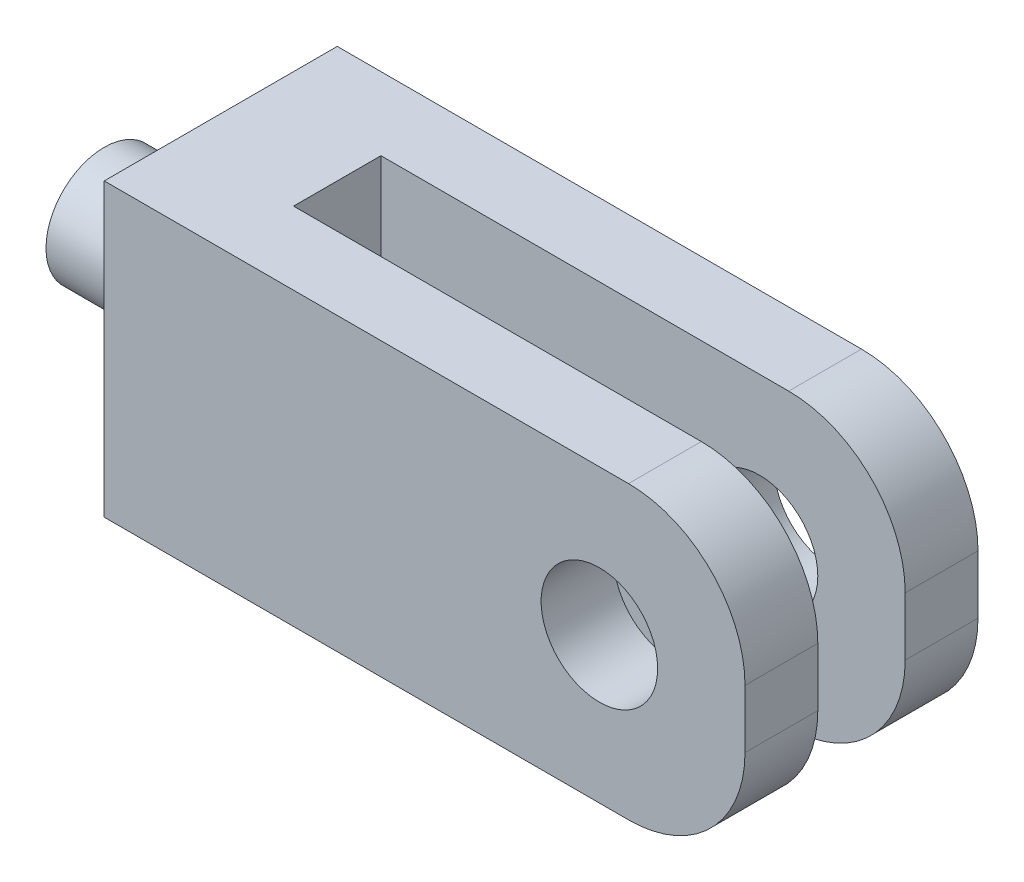
ISO-10303-21;
HEADER;
FILE_DESCRIPTION(('STEP AP214'),'2;1');
FILE_NAME('part.step','',(''),(''),'','','');
FILE_SCHEMA(('AUTOMOTIVE_DESIGN { 1 0 10303 214 1 1 1 1 }'));
ENDSEC;
DATA;
#1=APPLICATION_CONTEXT('core data for automotive mechanical design processes');
#2=APPLICATION_PROTOCOL_DEFINITION('international standard','automotive_design',2000,#1);
#3=PRODUCT_CONTEXT('',#1,'mechanical');
#4=PRODUCT('Part','Part','',(#3));
#5=PRODUCT_RELATED_PRODUCT_CATEGORY('part','',(#4));
#6=PRODUCT_DEFINITION_FORMATION('','',#4);
#7=PRODUCT_DEFINITION_CONTEXT('part definition',#1,'design');
#8=PRODUCT_DEFINITION('design','',#6,#7);
#9=PRODUCT_DEFINITION_SHAPE('','',#8);
#10=(LENGTH_UNIT() NAMED_UNIT(*) SI_UNIT(.MILLI.,.METRE.));
#11=(NAMED_UNIT(*) PLANE_ANGLE_UNIT() SI_UNIT($,.RADIAN.));
#12=(NAMED_UNIT(*) SI_UNIT($,.STERADIAN.) SOLID_ANGLE_UNIT());
#13=UNCERTAINTY_MEASURE_WITH_UNIT(LENGTH_MEASURE(1.E-05),#10,'distance_accuracy_value','');
#14=(GEOMETRIC_REPRESENTATION_CONTEXT(3) GLOBAL_UNCERTAINTY_ASSIGNED_CONTEXT((#13)) GLOBAL_UNIT_ASSIGNED_CONTEXT((#10,
#11,#12)) REPRESENTATION_CONTEXT('',''));
#15=CARTESIAN_POINT('',(0.,0.,0.));
#16=DIRECTION('',(0.,0.,1.));
#17=DIRECTION('',(1.,0.,0.));
#18=AXIS2_PLACEMENT_3D('',#15,#16,#17);
#19=CARTESIAN_POINT('',(82.5,37.5,60.));
#20=DIRECTION('',(1.,0.,0.));
#21=DIRECTION('',(0.,1.,0.));
#22=AXIS2_PLACEMENT_3D('',#19,#20,#21);
#23=PLANE('',#22);
#24=DIRECTION('',(0.,-1.,0.));
#25=VECTOR('',#24,1.);
#26=CARTESIAN_POINT('',(82.5,37.5,60.));
#27=LINE('',#26,#25);
#28=CARTESIAN_POINT('',(82.5,7.50000000000001,60.));
#29=VERTEX_POINT('',#28);
#30=CARTESIAN_POINT('',(82.5,-7.49999999999999,60.));
#31=VERTEX_POINT('',#30);
#32=EDGE_CURVE('E155',#29,#31,#27,.T.);
#33=ORIENTED_EDGE('',*,*,#32,.T.);
#34=DIRECTION('',(0.,0.,-1.));
#35=VECTOR('',#34,1.);
#36=CARTESIAN_POINT('',(82.5,-7.49999999999999,60.));
#37=LINE('',#36,#35);
#38=CARTESIAN_POINT('',(82.5,-7.49999999999999,41.25));
#39=VERTEX_POINT('',#38);
#40=EDGE_CURVE('E183',#31,#39,#37,.T.);
#41=ORIENTED_EDGE('',*,*,#40,.T.);
#42=DIRECTION('',(0.,-1.,0.));
#43=VECTOR('',#42,1.);
#44=CARTESIAN_POINT('',(82.5,-37.5,41.25));
#45=LINE('',#44,#43);
#46=CARTESIAN_POINT('',(82.5,7.50000000000001,41.25));
#47=VERTEX_POINT('',#46);
#48=EDGE_CURVE('E218',#47,#39,#45,.T.);
#49=ORIENTED_EDGE('',*,*,#48,.F.);
#50=DIRECTION('',(0.,0.,-1.));
#51=VECTOR('',#50,1.);
#52=CARTESIAN_POINT('',(82.5,7.50000000000001,60.));
#53=LINE('',#52,#51);
#54=EDGE_CURVE('E179',#47,#29,#53,.F.);
#55=ORIENTED_EDGE('',*,*,#54,.T.);
#56=EDGE_LOOP('',(#33,#41,#49,#55));
#57=FACE_BOUND('',#56,.T.);
#58=ADVANCED_FACE('F34',(#57),#23,.T.);
#59=DIRECTION('',(0.,1.,0.));
#60=VECTOR('',#59,1.);
#61=CARTESIAN_POINT('',(82.5,-37.5,18.75));
#62=LINE('',#61,#60);
#63=CARTESIAN_POINT('',(82.5,-7.49999999999999,18.75));
#64=VERTEX_POINT('',#63);
#65=CARTESIAN_POINT('',(82.5,7.50000000000001,18.75));
#66=VERTEX_POINT('',#65);
#67=EDGE_CURVE('E230',#64,#66,#62,.T.);
#68=ORIENTED_EDGE('',*,*,#67,.F.);
#69=DIRECTION('',(0.,0.,-1.));
#70=VECTOR('',#69,1.);
#71=CARTESIAN_POINT('',(82.5,-7.49999999999999,60.));
#72=LINE('',#71,#70);
#73=CARTESIAN_POINT('',(82.5,-7.49999999999999,0.));
#74=VERTEX_POINT('',#73);
#75=EDGE_CURVE('E199',#64,#74,#72,.T.);
#76=ORIENTED_EDGE('',*,*,#75,.T.);
#77=DIRECTION('',(0.,-1.,0.));
#78=VECTOR('',#77,1.);
#79=CARTESIAN_POINT('',(82.5,37.5,0.));
#80=LINE('',#79,#78);
#81=CARTESIAN_POINT('',(82.5,7.50000000000001,0.));
#82=VERTEX_POINT('',#81);
#83=EDGE_CURVE('E167',#82,#74,#80,.T.);
#84=ORIENTED_EDGE('',*,*,#83,.F.);
#85=DIRECTION('',(0.,0.,-1.));
#86=VECTOR('',#85,1.);
#87=CARTESIAN_POINT('',(82.5,7.50000000000001,18.75));
#88=LINE('',#87,#86);
#89=EDGE_CURVE('E197',#82,#66,#88,.F.);
#90=ORIENTED_EDGE('',*,*,#89,.T.);
#91=EDGE_LOOP('',(#68,#76,#84,#90));
#92=FACE_BOUND('',#91,.T.);
#93=ADVANCED_FACE('F271',(#92),#23,.T.);
#94=CARTESIAN_POINT('',(82.5,37.5,60.));
#95=DIRECTION('',(0.,-1.,0.));
#96=DIRECTION('',(1.,0.,0.));
#97=AXIS2_PLACEMENT_3D('',#94,#95,#96);
#98=PLANE('',#97);
#99=DIRECTION('',(1.,0.,0.));
#100=VECTOR('',#99,1.);
#101=CARTESIAN_POINT('',(-52.5,37.5,18.75));
#102=LINE('',#101,#100);
#103=CARTESIAN_POINT('',(-52.5,37.5,18.75));
#104=VERTEX_POINT('',#103);
#105=CARTESIAN_POINT('',(52.5,37.5,18.75));
#106=VERTEX_POINT('',#105);
#107=EDGE_CURVE('E130',#104,#106,#102,.T.);
#108=ORIENTED_EDGE('',*,*,#107,.T.);
#109=DIRECTION('',(0.,0.,-1.));
#110=VECTOR('',#109,1.);
#111=CARTESIAN_POINT('',(52.5,37.5,0.));
#112=LINE('',#111,#110);
#113=CARTESIAN_POINT('',(52.5,37.5,0.));
#114=VERTEX_POINT('',#113);
#115=EDGE_CURVE('E42',#106,#114,#112,.T.);
#116=ORIENTED_EDGE('',*,*,#115,.T.);
#117=DIRECTION('',(-1.,0.,0.));
#118=VECTOR('',#117,1.);
#119=CARTESIAN_POINT('',(82.5,37.5,0.));
#120=LINE('',#119,#118);
#121=CARTESIAN_POINT('',(-82.5,37.5,0.));
#122=VERTEX_POINT('',#121);
#123=EDGE_CURVE('E159',#114,#122,#120,.T.);
#124=ORIENTED_EDGE('',*,*,#123,.T.);
#125=DIRECTION('',(0.,0.,-1.));
#126=VECTOR('',#125,1.);
#127=CARTESIAN_POINT('',(-82.5,37.5,60.));
#128=LINE('',#127,#126);
#129=CARTESIAN_POINT('',(-82.5,37.5,60.));
#130=VERTEX_POINT('',#129);
#131=EDGE_CURVE('E176',#130,#122,#128,.T.);
#132=ORIENTED_EDGE('',*,*,#131,.F.);
#133=DIRECTION('',(-1.,0.,0.));
#134=VECTOR('',#133,1.);
#135=CARTESIAN_POINT('',(82.5,37.5,60.));
#136=LINE('',#135,#134);
#137=CARTESIAN_POINT('',(52.5,37.5,60.));
#138=VERTEX_POINT('',#137);
#139=EDGE_CURVE('E164',#138,#130,#136,.T.);
#140=ORIENTED_EDGE('',*,*,#139,.F.);
#141=DIRECTION('',(0.,0.,-1.));
#142=VECTOR('',#141,1.);
#143=CARTESIAN_POINT('',(52.5,37.5,41.25));
#144=LINE('',#143,#142);
#145=CARTESIAN_POINT('',(52.5,37.5,41.25));
#146=VERTEX_POINT('',#145);
#147=EDGE_CURVE('E208',#138,#146,#144,.T.);
#148=ORIENTED_EDGE('',*,*,#147,.T.);
#149=DIRECTION('',(1.,0.,0.));
#150=VECTOR('',#149,1.);
#151=CARTESIAN_POINT('',(-52.5,37.5,41.25));
#152=LINE('',#151,#150);
#153=CARTESIAN_POINT('',(-52.5,37.5,41.25));
#154=VERTEX_POINT('',#153);
#155=EDGE_CURVE('E150',#154,#146,#152,.T.);
#156=ORIENTED_EDGE('',*,*,#155,.F.);
#157=DIRECTION('',(0.,0.,1.));
#158=VECTOR('',#157,1.);
#159=CARTESIAN_POINT('',(-52.5,37.5,41.25));
#160=LINE('',#159,#158);
#161=EDGE_CURVE('E134',#104,#154,#160,.T.);
#162=ORIENTED_EDGE('',*,*,#161,.F.);
#163=EDGE_LOOP('',(#108,#116,#124,#132,#140,#148,#156,#162));
#164=FACE_BOUND('',#163,.T.);
#165=ADVANCED_FACE('F241',(#164),#98,.F.);
#166=CARTESIAN_POINT('',(-82.5,37.5,60.));
#167=DIRECTION('',(1.,0.,0.));
#168=DIRECTION('',(0.,0.,-1.));
#169=AXIS2_PLACEMENT_3D('',#166,#167,#168);
#170=PLANE('',#169);
#171=CARTESIAN_POINT('',(-82.5,0.,30.));
#172=DIRECTION('',(1.,0.,0.));
#173=DIRECTION('',(0.,0.,-1.));
#174=AXIS2_PLACEMENT_3D('',#171,#172,#173);
#175=CIRCLE('',#174,15.);
#176=CARTESIAN_POINT('',(-82.5,0.,15.));
#177=VERTEX_POINT('',#176);
#178=EDGE_CURVE('E11',#177,#177,#175,.F.);
#179=ORIENTED_EDGE('',*,*,#178,.F.);
#180=EDGE_LOOP('',(#179));
#181=FACE_BOUND('',#180,.T.);
#182=DIRECTION('',(0.,-1.,0.));
#183=VECTOR('',#182,1.);
#184=CARTESIAN_POINT('',(-82.5,37.5,0.));
#185=LINE('',#184,#183);
#186=CARTESIAN_POINT('',(-82.5,-37.5,0.));
#187=VERTEX_POINT('',#186);
#188=EDGE_CURVE('E172',#122,#187,#185,.T.);
#189=ORIENTED_EDGE('',*,*,#188,.T.);
#190=DIRECTION('',(0.,0.,-1.));
#191=VECTOR('',#190,1.);
#192=CARTESIAN_POINT('',(-82.5,-37.5,60.));
#193=LINE('',#192,#191);
#194=CARTESIAN_POINT('',(-82.5,-37.5,60.));
#195=VERTEX_POINT('',#194);
#196=EDGE_CURVE('E166',#195,#187,#193,.T.);
#197=ORIENTED_EDGE('',*,*,#196,.F.);
#198=DIRECTION('',(0.,-1.,0.));
#199=VECTOR('',#198,1.);
#200=CARTESIAN_POINT('',(-82.5,37.5,60.));
#201=LINE('',#200,#199);
#202=EDGE_CURVE('E161',#130,#195,#201,.T.);
#203=ORIENTED_EDGE('',*,*,#202,.F.);
#204=ORIENTED_EDGE('',*,*,#131,.T.);
#205=EDGE_LOOP('',(#189,#197,#203,#204));
#206=FACE_BOUND('',#205,.T.);
#207=ADVANCED_FACE('F261',(#181,#206),#170,.F.);
#208=CARTESIAN_POINT('',(82.5,-37.5,60.));
#209=DIRECTION('',(0.,-1.,0.));
#210=DIRECTION('',(1.,0.,0.));
#211=AXIS2_PLACEMENT_3D('',#208,#209,#210);
#212=PLANE('',#211);
#213=DIRECTION('',(1.,0.,0.));
#214=VECTOR('',#213,1.);
#215=CARTESIAN_POINT('',(-52.5,-37.5,41.25));
#216=LINE('',#215,#214);
#217=CARTESIAN_POINT('',(-52.5,-37.5,41.25));
#218=VERTEX_POINT('',#217);
#219=CARTESIAN_POINT('',(52.5,-37.5,41.25));
#220=VERTEX_POINT('',#219);
#221=EDGE_CURVE('E148',#218,#220,#216,.T.);
#222=ORIENTED_EDGE('',*,*,#221,.T.);
#223=DIRECTION('',(0.,0.,-1.));
#224=VECTOR('',#223,1.);
#225=CARTESIAN_POINT('',(52.5,-37.5,60.));
#226=LINE('',#225,#224);
#227=CARTESIAN_POINT('',(52.5,-37.5,60.));
#228=VERTEX_POINT('',#227);
#229=EDGE_CURVE('E191',#220,#228,#226,.F.);
#230=ORIENTED_EDGE('',*,*,#229,.T.);
#231=DIRECTION('',(-1.,0.,0.));
#232=VECTOR('',#231,1.);
#233=CARTESIAN_POINT('',(82.5,-37.5,60.));
#234=LINE('',#233,#232);
#235=EDGE_CURVE('E158',#228,#195,#234,.T.);
#236=ORIENTED_EDGE('',*,*,#235,.T.);
#237=ORIENTED_EDGE('',*,*,#196,.T.);
#238=DIRECTION('',(-1.,0.,0.));
#239=VECTOR('',#238,1.);
#240=CARTESIAN_POINT('',(82.5,-37.5,0.));
#241=LINE('',#240,#239);
#242=CARTESIAN_POINT('',(52.5,-37.5,0.));
#243=VERTEX_POINT('',#242);
#244=EDGE_CURVE('E170',#243,#187,#241,.T.);
#245=ORIENTED_EDGE('',*,*,#244,.F.);
#246=DIRECTION('',(0.,0.,-1.));
#247=VECTOR('',#246,1.);
#248=CARTESIAN_POINT('',(52.5,-37.5,60.));
#249=LINE('',#248,#247);
#250=CARTESIAN_POINT('',(52.5,-37.5,18.75));
#251=VERTEX_POINT('',#250);
#252=EDGE_CURVE('E147',#243,#251,#249,.F.);
#253=ORIENTED_EDGE('',*,*,#252,.T.);
#254=DIRECTION('',(1.,0.,0.));
#255=VECTOR('',#254,1.);
#256=CARTESIAN_POINT('',(-52.5,-37.5,18.75));
#257=LINE('',#256,#255);
#258=CARTESIAN_POINT('',(-52.5,-37.5,18.75));
#259=VERTEX_POINT('',#258);
#260=EDGE_CURVE('E128',#259,#251,#257,.T.);
#261=ORIENTED_EDGE('',*,*,#260,.F.);
#262=DIRECTION('',(0.,0.,-1.));
#263=VECTOR('',#262,1.);
#264=CARTESIAN_POINT('',(-52.5,-37.5,41.25));
#265=LINE('',#264,#263);
#266=EDGE_CURVE('E135',#218,#259,#265,.T.);
#267=ORIENTED_EDGE('',*,*,#266,.F.);
#268=EDGE_LOOP('',(#222,#230,#236,#237,#245,#253,#261,#267));
#269=FACE_BOUND('',#268,.T.);
#270=ADVANCED_FACE('F144',(#269),#212,.T.);
#271=CARTESIAN_POINT('',(0.,0.,60.));
#272=DIRECTION('',(0.,0.,-1.));
#273=DIRECTION('',(-1.,0.,0.));
#274=AXIS2_PLACEMENT_3D('',#271,#272,#273);
#275=PLANE('',#274);
#276=CARTESIAN_POINT('',(45.,0.,60.));
#277=DIRECTION('',(0.,0.,1.));
#278=DIRECTION('',(1.,0.,0.));
#279=AXIS2_PLACEMENT_3D('',#276,#277,#278);
#280=CIRCLE('',#279,15.);
#281=CARTESIAN_POINT('',(60.,0.,60.));
#282=VERTEX_POINT('',#281);
#283=EDGE_CURVE('E221',#282,#282,#280,.T.);
#284=ORIENTED_EDGE('',*,*,#283,.F.);
#285=EDGE_LOOP('',(#284));
#286=FACE_BOUND('',#285,.T.);
#287=ORIENTED_EDGE('',*,*,#235,.F.);
#288=CARTESIAN_POINT('',(52.5,-7.49999999999999,60.));
#289=DIRECTION('',(0.,0.,-1.));
#290=DIRECTION('',(-1.,0.,0.));
#291=AXIS2_PLACEMENT_3D('',#288,#289,#290);
#292=CIRCLE('',#291,30.);
#293=EDGE_CURVE('E195',#228,#31,#292,.F.);
#294=ORIENTED_EDGE('',*,*,#293,.T.);
#295=ORIENTED_EDGE('',*,*,#32,.F.);
#296=CARTESIAN_POINT('',(52.5,7.5,60.));
#297=DIRECTION('',(0.,0.,-1.));
#298=DIRECTION('',(-1.,0.,0.));
#299=AXIS2_PLACEMENT_3D('',#296,#297,#298);
#300=CIRCLE('',#299,30.);
#301=EDGE_CURVE('E193',#29,#138,#300,.F.);
#302=ORIENTED_EDGE('',*,*,#301,.T.);
#303=ORIENTED_EDGE('',*,*,#139,.T.);
#304=ORIENTED_EDGE('',*,*,#202,.T.);
#305=EDGE_LOOP('',(#287,#294,#295,#302,#303,#304));
#306=FACE_BOUND('',#305,.T.);
#307=ADVANCED_FACE('F253',(#286,#306),#275,.F.);
#308=CARTESIAN_POINT('',(0.,0.,0.));
#309=DIRECTION('',(0.,0.,-1.));
#310=DIRECTION('',(-1.,0.,0.));
#311=AXIS2_PLACEMENT_3D('',#308,#309,#310);
#312=PLANE('',#311);
#313=CARTESIAN_POINT('',(45.,0.,0.));
#314=DIRECTION('',(0.,0.,1.));
#315=DIRECTION('',(1.,0.,0.));
#316=AXIS2_PLACEMENT_3D('',#313,#314,#315);
#317=CIRCLE('',#316,15.);
#318=CARTESIAN_POINT('',(60.,0.,0.));
#319=VERTEX_POINT('',#318);
#320=EDGE_CURVE('E214',#319,#319,#317,.T.);
#321=ORIENTED_EDGE('',*,*,#320,.T.);
#322=EDGE_LOOP('',(#321));
#323=FACE_BOUND('',#322,.T.);
#324=ORIENTED_EDGE('',*,*,#83,.T.);
#325=CARTESIAN_POINT('',(52.5,-7.49999999999999,0.));
#326=DIRECTION('',(0.,0.,-1.));
#327=DIRECTION('',(-1.,0.,0.));
#328=AXIS2_PLACEMENT_3D('',#325,#326,#327);
#329=CIRCLE('',#328,30.);
#330=EDGE_CURVE('E203',#74,#243,#329,.T.);
#331=ORIENTED_EDGE('',*,*,#330,.T.);
#332=ORIENTED_EDGE('',*,*,#244,.T.);
#333=ORIENTED_EDGE('',*,*,#188,.F.);
#334=ORIENTED_EDGE('',*,*,#123,.F.);
#335=CARTESIAN_POINT('',(52.5,7.5,0.));
#336=DIRECTION('',(0.,0.,-1.));
#337=DIRECTION('',(-1.,0.,0.));
#338=AXIS2_PLACEMENT_3D('',#335,#336,#337);
#339=CIRCLE('',#338,30.);
#340=EDGE_CURVE('E57',#114,#82,#339,.T.);
#341=ORIENTED_EDGE('',*,*,#340,.T.);
#342=EDGE_LOOP('',(#324,#331,#332,#333,#334,#341));
#343=FACE_BOUND('',#342,.T.);
#344=ADVANCED_FACE('F265',(#323,#343),#312,.T.);
#345=CARTESIAN_POINT('',(-52.5,-37.5,41.25));
#346=DIRECTION('',(0.,0.,1.));
#347=DIRECTION('',(1.,0.,0.));
#348=AXIS2_PLACEMENT_3D('',#345,#346,#347);
#349=PLANE('',#348);
#350=CARTESIAN_POINT('',(45.,0.,41.25));
#351=DIRECTION('',(0.,0.,1.));
#352=DIRECTION('',(1.,0.,0.));
#353=AXIS2_PLACEMENT_3D('',#350,#351,#352);
#354=CIRCLE('',#353,15.);
#355=CARTESIAN_POINT('',(60.,0.,41.25));
#356=VERTEX_POINT('',#355);
#357=EDGE_CURVE('E213',#356,#356,#354,.T.);
#358=ORIENTED_EDGE('',*,*,#357,.T.);
#359=EDGE_LOOP('',(#358));
#360=FACE_BOUND('',#359,.T.);
#361=ORIENTED_EDGE('',*,*,#48,.T.);
#362=CARTESIAN_POINT('',(52.5,-7.49999999999999,41.25));
#363=DIRECTION('',(0.,0.,1.));
#364=DIRECTION('',(1.,0.,0.));
#365=AXIS2_PLACEMENT_3D('',#362,#363,#364);
#366=CIRCLE('',#365,30.);
#367=EDGE_CURVE('E188',#39,#220,#366,.F.);
#368=ORIENTED_EDGE('',*,*,#367,.T.);
#369=ORIENTED_EDGE('',*,*,#221,.F.);
#370=DIRECTION('',(0.,-1.,0.));
#371=VECTOR('',#370,1.);
#372=CARTESIAN_POINT('',(-52.5,-37.5,41.25));
#373=LINE('',#372,#371);
#374=EDGE_CURVE('E139',#154,#218,#373,.T.);
#375=ORIENTED_EDGE('',*,*,#374,.F.);
#376=ORIENTED_EDGE('',*,*,#155,.T.);
#377=CARTESIAN_POINT('',(52.5,7.5,41.25));
#378=DIRECTION('',(0.,0.,1.));
#379=DIRECTION('',(1.,0.,0.));
#380=AXIS2_PLACEMENT_3D('',#377,#378,#379);
#381=CIRCLE('',#380,30.);
#382=EDGE_CURVE('E186',#146,#47,#381,.F.);
#383=ORIENTED_EDGE('',*,*,#382,.T.);
#384=EDGE_LOOP('',(#361,#368,#369,#375,#376,#383));
#385=FACE_BOUND('',#384,.T.);
#386=ADVANCED_FACE('F238',(#360,#385),#349,.F.);
#387=CARTESIAN_POINT('',(-52.5,-37.5,18.75));
#388=DIRECTION('',(0.,0.,-1.));
#389=DIRECTION('',(0.,1.,0.));
#390=AXIS2_PLACEMENT_3D('',#387,#388,#389);
#391=PLANE('',#390);
#392=CARTESIAN_POINT('',(45.,0.,18.75));
#393=DIRECTION('',(0.,0.,-1.));
#394=DIRECTION('',(0.,1.,0.));
#395=AXIS2_PLACEMENT_3D('',#392,#393,#394);
#396=CIRCLE('',#395,15.);
#397=CARTESIAN_POINT('',(45.,15.,18.75));
#398=VERTEX_POINT('',#397);
#399=EDGE_CURVE('E211',#398,#398,#396,.T.);
#400=ORIENTED_EDGE('',*,*,#399,.T.);
#401=EDGE_LOOP('',(#400));
#402=FACE_BOUND('',#401,.T.);
#403=ORIENTED_EDGE('',*,*,#260,.T.);
#404=CARTESIAN_POINT('',(52.5,-7.49999999999999,18.75));
#405=DIRECTION('',(0.,0.,-1.));
#406=DIRECTION('',(0.,1.,0.));
#407=AXIS2_PLACEMENT_3D('',#404,#405,#406);
#408=CIRCLE('',#407,30.);
#409=EDGE_CURVE('E206',#251,#64,#408,.F.);
#410=ORIENTED_EDGE('',*,*,#409,.T.);
#411=ORIENTED_EDGE('',*,*,#67,.T.);
#412=CARTESIAN_POINT('',(52.5,7.5,18.75));
#413=DIRECTION('',(0.,0.,-1.));
#414=DIRECTION('',(0.,1.,0.));
#415=AXIS2_PLACEMENT_3D('',#412,#413,#414);
#416=CIRCLE('',#415,30.);
#417=EDGE_CURVE('E49',#66,#106,#416,.F.);
#418=ORIENTED_EDGE('',*,*,#417,.T.);
#419=ORIENTED_EDGE('',*,*,#107,.F.);
#420=DIRECTION('',(0.,1.,0.));
#421=VECTOR('',#420,1.);
#422=CARTESIAN_POINT('',(-52.5,-37.5,18.75));
#423=LINE('',#422,#421);
#424=EDGE_CURVE('E124',#259,#104,#423,.T.);
#425=ORIENTED_EDGE('',*,*,#424,.F.);
#426=EDGE_LOOP('',(#403,#410,#411,#418,#419,#425));
#427=FACE_BOUND('',#426,.T.);
#428=ADVANCED_FACE('F126',(#402,#427),#391,.F.);
#429=CARTESIAN_POINT('',(-52.5,0.,0.));
#430=DIRECTION('',(-1.,0.,0.));
#431=DIRECTION('',(0.,-1.,0.));
#432=AXIS2_PLACEMENT_3D('',#429,#430,#431);
#433=PLANE('',#432);
#434=ORIENTED_EDGE('',*,*,#374,.T.);
#435=ORIENTED_EDGE('',*,*,#266,.T.);
#436=ORIENTED_EDGE('',*,*,#424,.T.);
#437=ORIENTED_EDGE('',*,*,#161,.T.);
#438=EDGE_LOOP('',(#434,#435,#436,#437));
#439=FACE_BOUND('',#438,.T.);
#440=ADVANCED_FACE('F138',(#439),#433,.F.);
#441=CARTESIAN_POINT('',(52.5,-7.49999999999999,60.));
#442=DIRECTION('',(0.,0.,-1.));
#443=DIRECTION('',(-1.,0.,0.));
#444=AXIS2_PLACEMENT_3D('',#441,#442,#443);
#445=CYLINDRICAL_SURFACE('',#444,30.);
#446=ORIENTED_EDGE('',*,*,#293,.F.);
#447=ORIENTED_EDGE('',*,*,#229,.F.);
#448=ORIENTED_EDGE('',*,*,#367,.F.);
#449=ORIENTED_EDGE('',*,*,#40,.F.);
#450=EDGE_LOOP('',(#446,#447,#448,#449));
#451=FACE_BOUND('',#450,.T.);
#452=ADVANCED_FACE('F257',(#451),#445,.T.);
#453=CARTESIAN_POINT('',(52.5,-7.49999999999999,60.));
#454=DIRECTION('',(0.,0.,-1.));
#455=DIRECTION('',(-1.,0.,0.));
#456=AXIS2_PLACEMENT_3D('',#453,#454,#455);
#457=CYLINDRICAL_SURFACE('',#456,30.);
#458=ORIENTED_EDGE('',*,*,#409,.F.);
#459=ORIENTED_EDGE('',*,*,#252,.F.);
#460=ORIENTED_EDGE('',*,*,#330,.F.);
#461=ORIENTED_EDGE('',*,*,#75,.F.);
#462=EDGE_LOOP('',(#458,#459,#460,#461));
#463=FACE_BOUND('',#462,.T.);
#464=ADVANCED_FACE('F267',(#463),#457,.T.);
#465=CARTESIAN_POINT('',(52.5,7.5,60.));
#466=DIRECTION('',(0.,0.,1.));
#467=DIRECTION('',(1.,0.,0.));
#468=AXIS2_PLACEMENT_3D('',#465,#466,#467);
#469=CYLINDRICAL_SURFACE('',#468,30.);
#470=ORIENTED_EDGE('',*,*,#417,.F.);
#471=ORIENTED_EDGE('',*,*,#89,.F.);
#472=ORIENTED_EDGE('',*,*,#340,.F.);
#473=ORIENTED_EDGE('',*,*,#115,.F.);
#474=EDGE_LOOP('',(#470,#471,#472,#473));
#475=FACE_BOUND('',#474,.T.);
#476=ADVANCED_FACE('F273',(#475),#469,.T.);
#477=CARTESIAN_POINT('',(52.5,7.5,60.));
#478=DIRECTION('',(0.,0.,1.));
#479=DIRECTION('',(1.,0.,0.));
#480=AXIS2_PLACEMENT_3D('',#477,#478,#479);
#481=CYLINDRICAL_SURFACE('',#480,30.);
#482=ORIENTED_EDGE('',*,*,#301,.F.);
#483=ORIENTED_EDGE('',*,*,#54,.F.);
#484=ORIENTED_EDGE('',*,*,#382,.F.);
#485=ORIENTED_EDGE('',*,*,#147,.F.);
#486=EDGE_LOOP('',(#482,#483,#484,#485));
#487=FACE_BOUND('',#486,.T.);
#488=ADVANCED_FACE('F36',(#487),#481,.T.);
#489=CARTESIAN_POINT('',(45.,0.,0.));
#490=DIRECTION('',(0.,0.,1.));
#491=DIRECTION('',(1.,0.,0.));
#492=AXIS2_PLACEMENT_3D('',#489,#490,#491);
#493=CYLINDRICAL_SURFACE('',#492,15.);
#494=ORIENTED_EDGE('',*,*,#320,.F.);
#495=EDGE_LOOP('',(#494));
#496=FACE_BOUND('',#495,.T.);
#497=ORIENTED_EDGE('',*,*,#399,.F.);
#498=EDGE_LOOP('',(#497));
#499=FACE_BOUND('',#498,.T.);
#500=ADVANCED_FACE('F279',(#496,#499),#493,.F.);
#501=ORIENTED_EDGE('',*,*,#283,.T.);
#502=EDGE_LOOP('',(#501));
#503=FACE_BOUND('',#502,.T.);
#504=ORIENTED_EDGE('',*,*,#357,.F.);
#505=EDGE_LOOP('',(#504));
#506=FACE_BOUND('',#505,.T.);
#507=ADVANCED_FACE('F299',(#503,#506),#493,.F.);
#508=CARTESIAN_POINT('',(-112.5,0.,30.));
#509=DIRECTION('',(1.,0.,0.));
#510=DIRECTION('',(0.,0.,-1.));
#511=AXIS2_PLACEMENT_3D('',#508,#509,#510);
#512=CYLINDRICAL_SURFACE('',#511,15.);
#513=CARTESIAN_POINT('',(-112.5,0.,30.));
#514=DIRECTION('',(-1.,0.,0.));
#515=DIRECTION('',(0.,0.,1.));
#516=AXIS2_PLACEMENT_3D('',#513,#514,#515);
#517=CIRCLE('',#516,15.);
#518=CARTESIAN_POINT('',(-112.5,0.,45.));
#519=VERTEX_POINT('',#518);
#520=EDGE_CURVE('E226',#519,#519,#517,.T.);
#521=ORIENTED_EDGE('',*,*,#520,.F.);
#522=EDGE_LOOP('',(#521));
#523=FACE_BOUND('',#522,.T.);
#524=ORIENTED_EDGE('',*,*,#178,.T.);
#525=EDGE_LOOP('',(#524));
#526=FACE_BOUND('',#525,.T.);
#527=ADVANCED_FACE('F318',(#523,#526),#512,.T.);
#528=CARTESIAN_POINT('',(-112.5,0.,30.));
#529=DIRECTION('',(-1.,0.,0.));
#530=DIRECTION('',(0.,0.,1.));
#531=AXIS2_PLACEMENT_3D('',#528,#529,#530);
#532=PLANE('',#531);
#533=ORIENTED_EDGE('',*,*,#520,.T.);
#534=EDGE_LOOP('',(#533));
#535=FACE_BOUND('',#534,.T.);
#536=ADVANCED_FACE('F320',(#535),#532,.T.);
#537=CLOSED_SHELL('',(#58,#93,#165,#207,#270,#307,#344,#386,#428,#440,#452,#464,#476,#488,#500,
#507,#527,#536));
#538=MANIFOLD_SOLID_BREP('B2',#537);
#539=ADVANCED_BREP_SHAPE_REPRESENTATION('',(#18,#538),#14);
#540=SHAPE_DEFINITION_REPRESENTATION(#9,#539);
ENDSEC;
END-ISO-10303-21;
